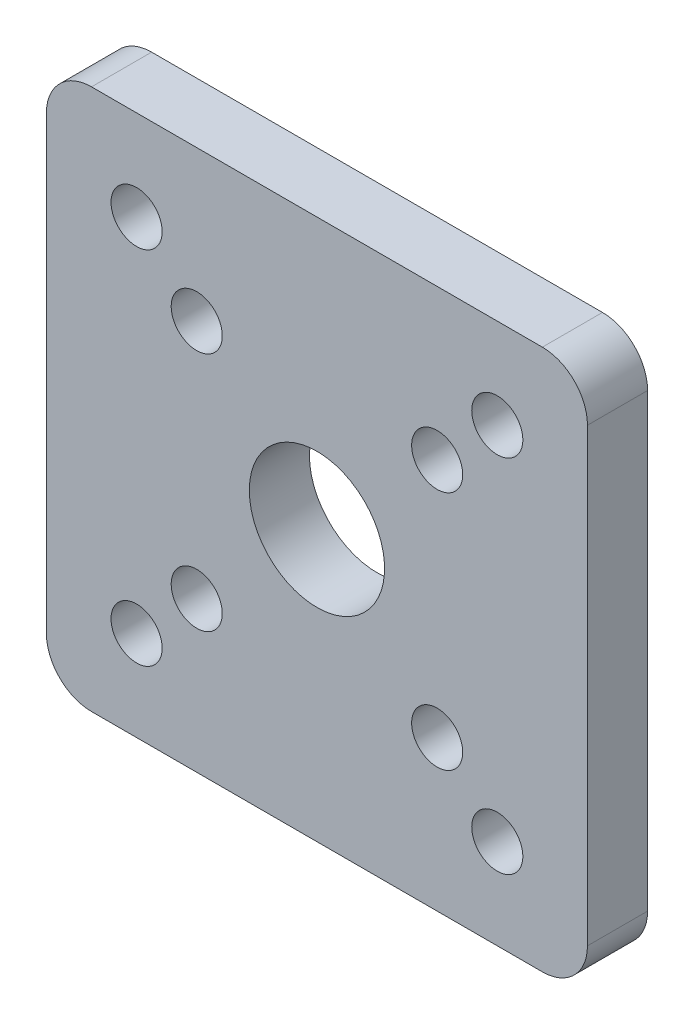
ISO-10303-21;
HEADER;
FILE_DESCRIPTION(('STEP AP214'),'2;1');
FILE_NAME('part.step','',(''),(''),'','','');
FILE_SCHEMA(('AUTOMOTIVE_DESIGN { 1 0 10303 214 1 1 1 1 }'));
ENDSEC;
DATA;
#1=APPLICATION_CONTEXT('core data for automotive mechanical design processes');
#2=APPLICATION_PROTOCOL_DEFINITION('international standard','automotive_design',2000,#1);
#3=PRODUCT_CONTEXT('',#1,'mechanical');
#4=PRODUCT('Part','Part','',(#3));
#5=PRODUCT_RELATED_PRODUCT_CATEGORY('part','',(#4));
#6=PRODUCT_DEFINITION_FORMATION('','',#4);
#7=PRODUCT_DEFINITION_CONTEXT('part definition',#1,'design');
#8=PRODUCT_DEFINITION('design','',#6,#7);
#9=PRODUCT_DEFINITION_SHAPE('','',#8);
#10=(LENGTH_UNIT() NAMED_UNIT(*) SI_UNIT(.MILLI.,.METRE.));
#11=(NAMED_UNIT(*) PLANE_ANGLE_UNIT() SI_UNIT($,.RADIAN.));
#12=(NAMED_UNIT(*) SI_UNIT($,.STERADIAN.) SOLID_ANGLE_UNIT());
#13=UNCERTAINTY_MEASURE_WITH_UNIT(LENGTH_MEASURE(1.E-05),#10,'distance_accuracy_value','');
#14=(GEOMETRIC_REPRESENTATION_CONTEXT(3) GLOBAL_UNCERTAINTY_ASSIGNED_CONTEXT((#13)) GLOBAL_UNIT_ASSIGNED_CONTEXT((#10,
#11,#12)) REPRESENTATION_CONTEXT('',''));
#15=CARTESIAN_POINT('',(0.,0.,0.));
#16=DIRECTION('',(0.,0.,1.));
#17=DIRECTION('',(1.,0.,0.));
#18=AXIS2_PLACEMENT_3D('',#15,#16,#17);
#19=CARTESIAN_POINT('',(127.,60.,12.));
#20=DIRECTION('',(0.,0.,1.));
#21=DIRECTION('',(1.,0.,0.));
#22=AXIS2_PLACEMENT_3D('',#19,#20,#21);
#23=PLANE('',#22);
#24=CARTESIAN_POINT('',(157.,90.,12.));
#25=DIRECTION('',(0.,0.,-1.));
#26=DIRECTION('',(-1.,0.,0.));
#27=AXIS2_PLACEMENT_3D('',#24,#25,#26);
#28=CIRCLE('',#27,1.7);
#29=CARTESIAN_POINT('',(155.3,90.,12.));
#30=VERTEX_POINT('',#29);
#31=EDGE_CURVE('E151',#30,#30,#28,.F.);
#32=ORIENTED_EDGE('',*,*,#31,.T.);
#33=EDGE_LOOP('',(#32));
#34=FACE_BOUND('',#33,.T.);
#35=CARTESIAN_POINT('',(153.,86.,12.));
#36=DIRECTION('',(0.,0.,-1.));
#37=DIRECTION('',(-1.,0.,0.));
#38=AXIS2_PLACEMENT_3D('',#35,#36,#37);
#39=CIRCLE('',#38,1.7);
#40=CARTESIAN_POINT('',(151.3,86.,12.));
#41=VERTEX_POINT('',#40);
#42=EDGE_CURVE('E154',#41,#41,#39,.F.);
#43=ORIENTED_EDGE('',*,*,#42,.T.);
#44=EDGE_LOOP('',(#43));
#45=FACE_BOUND('',#44,.T.);
#46=CARTESIAN_POINT('',(145.,78.,12.));
#47=DIRECTION('',(0.,0.,-1.));
#48=DIRECTION('',(-1.,0.,0.));
#49=AXIS2_PLACEMENT_3D('',#46,#47,#48);
#50=CIRCLE('',#49,4.5);
#51=CARTESIAN_POINT('',(140.5,78.,12.));
#52=VERTEX_POINT('',#51);
#53=EDGE_CURVE('E157',#52,#52,#50,.F.);
#54=ORIENTED_EDGE('',*,*,#53,.T.);
#55=EDGE_LOOP('',(#54));
#56=FACE_BOUND('',#55,.T.);
#57=CARTESIAN_POINT('',(133.,90.,12.));
#58=DIRECTION('',(0.,0.,-1.));
#59=DIRECTION('',(-1.,0.,0.));
#60=AXIS2_PLACEMENT_3D('',#57,#58,#59);
#61=CIRCLE('',#60,1.7);
#62=CARTESIAN_POINT('',(131.3,90.,12.));
#63=VERTEX_POINT('',#62);
#64=EDGE_CURVE('E160',#63,#63,#61,.F.);
#65=ORIENTED_EDGE('',*,*,#64,.T.);
#66=EDGE_LOOP('',(#65));
#67=FACE_BOUND('',#66,.T.);
#68=CARTESIAN_POINT('',(137.,86.,12.));
#69=DIRECTION('',(0.,0.,-1.));
#70=DIRECTION('',(-1.,0.,0.));
#71=AXIS2_PLACEMENT_3D('',#68,#69,#70);
#72=CIRCLE('',#71,1.7);
#73=CARTESIAN_POINT('',(135.3,86.,12.));
#74=VERTEX_POINT('',#73);
#75=EDGE_CURVE('E163',#74,#74,#72,.F.);
#76=ORIENTED_EDGE('',*,*,#75,.T.);
#77=EDGE_LOOP('',(#76));
#78=FACE_BOUND('',#77,.T.);
#79=CARTESIAN_POINT('',(153.,70.,12.));
#80=DIRECTION('',(0.,0.,-1.));
#81=DIRECTION('',(-1.,0.,0.));
#82=AXIS2_PLACEMENT_3D('',#79,#80,#81);
#83=CIRCLE('',#82,1.7);
#84=CARTESIAN_POINT('',(151.3,70.,12.));
#85=VERTEX_POINT('',#84);
#86=EDGE_CURVE('E166',#85,#85,#83,.F.);
#87=ORIENTED_EDGE('',*,*,#86,.T.);
#88=EDGE_LOOP('',(#87));
#89=FACE_BOUND('',#88,.T.);
#90=CARTESIAN_POINT('',(157.,66.,12.));
#91=DIRECTION('',(0.,0.,-1.));
#92=DIRECTION('',(-1.,0.,0.));
#93=AXIS2_PLACEMENT_3D('',#90,#91,#92);
#94=CIRCLE('',#93,1.7);
#95=CARTESIAN_POINT('',(155.3,66.,12.));
#96=VERTEX_POINT('',#95);
#97=EDGE_CURVE('E169',#96,#96,#94,.F.);
#98=ORIENTED_EDGE('',*,*,#97,.T.);
#99=EDGE_LOOP('',(#98));
#100=FACE_BOUND('',#99,.T.);
#101=CARTESIAN_POINT('',(137.,70.,12.));
#102=DIRECTION('',(0.,0.,-1.));
#103=DIRECTION('',(-1.,0.,0.));
#104=AXIS2_PLACEMENT_3D('',#101,#102,#103);
#105=CIRCLE('',#104,1.7);
#106=CARTESIAN_POINT('',(135.3,70.,12.));
#107=VERTEX_POINT('',#106);
#108=EDGE_CURVE('E172',#107,#107,#105,.F.);
#109=ORIENTED_EDGE('',*,*,#108,.T.);
#110=EDGE_LOOP('',(#109));
#111=FACE_BOUND('',#110,.T.);
#112=CARTESIAN_POINT('',(133.,66.,12.));
#113=DIRECTION('',(0.,0.,-1.));
#114=DIRECTION('',(-1.,0.,0.));
#115=AXIS2_PLACEMENT_3D('',#112,#113,#114);
#116=CIRCLE('',#115,1.7);
#117=CARTESIAN_POINT('',(131.3,66.,12.));
#118=VERTEX_POINT('',#117);
#119=EDGE_CURVE('E175',#118,#118,#116,.F.);
#120=ORIENTED_EDGE('',*,*,#119,.T.);
#121=EDGE_LOOP('',(#120));
#122=FACE_BOUND('',#121,.T.);
#123=DIRECTION('',(1.,0.,0.));
#124=VECTOR('',#123,1.);
#125=CARTESIAN_POINT('',(127.,96.,12.));
#126=LINE('',#125,#124);
#127=CARTESIAN_POINT('',(160.,96.,12.));
#128=VERTEX_POINT('',#127);
#129=CARTESIAN_POINT('',(130.,96.,12.));
#130=VERTEX_POINT('',#129);
#131=EDGE_CURVE('E104',#128,#130,#126,.F.);
#132=ORIENTED_EDGE('',*,*,#131,.F.);
#133=CARTESIAN_POINT('',(160.,93.,12.));
#134=DIRECTION('',(0.,0.,1.));
#135=DIRECTION('',(1.,0.,0.));
#136=AXIS2_PLACEMENT_3D('',#133,#134,#135);
#137=CIRCLE('',#136,3.);
#138=CARTESIAN_POINT('',(163.,93.,12.));
#139=VERTEX_POINT('',#138);
#140=EDGE_CURVE('E111',#139,#128,#137,.T.);
#141=ORIENTED_EDGE('',*,*,#140,.F.);
#142=DIRECTION('',(0.,1.,0.));
#143=VECTOR('',#142,1.);
#144=CARTESIAN_POINT('',(163.,60.,12.));
#145=LINE('',#144,#143);
#146=CARTESIAN_POINT('',(163.,63.,12.));
#147=VERTEX_POINT('',#146);
#148=EDGE_CURVE('E109',#147,#139,#145,.T.);
#149=ORIENTED_EDGE('',*,*,#148,.F.);
#150=CARTESIAN_POINT('',(160.,63.,12.));
#151=DIRECTION('',(0.,0.,1.));
#152=DIRECTION('',(1.,0.,0.));
#153=AXIS2_PLACEMENT_3D('',#150,#151,#152);
#154=CIRCLE('',#153,3.);
#155=CARTESIAN_POINT('',(160.,60.,12.));
#156=VERTEX_POINT('',#155);
#157=EDGE_CURVE('E81',#156,#147,#154,.T.);
#158=ORIENTED_EDGE('',*,*,#157,.F.);
#159=DIRECTION('',(1.,0.,0.));
#160=VECTOR('',#159,1.);
#161=CARTESIAN_POINT('',(127.,60.,12.));
#162=LINE('',#161,#160);
#163=CARTESIAN_POINT('',(130.,60.,12.));
#164=VERTEX_POINT('',#163);
#165=EDGE_CURVE('E79',#156,#164,#162,.F.);
#166=ORIENTED_EDGE('',*,*,#165,.T.);
#167=CARTESIAN_POINT('',(130.,63.,12.));
#168=DIRECTION('',(0.,0.,1.));
#169=DIRECTION('',(1.,0.,0.));
#170=AXIS2_PLACEMENT_3D('',#167,#168,#169);
#171=CIRCLE('',#170,3.);
#172=CARTESIAN_POINT('',(127.,63.,12.));
#173=VERTEX_POINT('',#172);
#174=EDGE_CURVE('E18',#173,#164,#171,.T.);
#175=ORIENTED_EDGE('',*,*,#174,.F.);
#176=DIRECTION('',(0.,1.,0.));
#177=VECTOR('',#176,1.);
#178=CARTESIAN_POINT('',(127.,60.,12.));
#179=LINE('',#178,#177);
#180=CARTESIAN_POINT('',(127.,93.,12.));
#181=VERTEX_POINT('',#180);
#182=EDGE_CURVE('E93',#173,#181,#179,.T.);
#183=ORIENTED_EDGE('',*,*,#182,.T.);
#184=CARTESIAN_POINT('',(130.,93.,12.));
#185=DIRECTION('',(0.,0.,1.));
#186=DIRECTION('',(1.,0.,0.));
#187=AXIS2_PLACEMENT_3D('',#184,#185,#186);
#188=CIRCLE('',#187,3.);
#189=EDGE_CURVE('E178',#130,#181,#188,.T.);
#190=ORIENTED_EDGE('',*,*,#189,.F.);
#191=EDGE_LOOP('',(#132,#141,#149,#158,#166,#175,#183,#190));
#192=FACE_BOUND('',#191,.T.);
#193=ADVANCED_FACE('F15',(#34,#45,#56,#67,#78,#89,#100,#111,#122,#192),#23,.F.);
#194=CARTESIAN_POINT('',(127.,60.,12.));
#195=DIRECTION('',(1.,0.,0.));
#196=DIRECTION('',(0.,0.,-1.));
#197=AXIS2_PLACEMENT_3D('',#194,#195,#196);
#198=PLANE('',#197);
#199=ORIENTED_EDGE('',*,*,#182,.F.);
#200=DIRECTION('',(0.,0.,1.));
#201=VECTOR('',#200,1.);
#202=CARTESIAN_POINT('',(127.,63.,12.));
#203=LINE('',#202,#201);
#204=CARTESIAN_POINT('',(127.,63.,16.));
#205=VERTEX_POINT('',#204);
#206=EDGE_CURVE('E86',#205,#173,#203,.F.);
#207=ORIENTED_EDGE('',*,*,#206,.F.);
#208=DIRECTION('',(0.,1.,0.));
#209=VECTOR('',#208,1.);
#210=CARTESIAN_POINT('',(127.,60.,16.));
#211=LINE('',#210,#209);
#212=CARTESIAN_POINT('',(127.,93.,16.));
#213=VERTEX_POINT('',#212);
#214=EDGE_CURVE('E150',#213,#205,#211,.F.);
#215=ORIENTED_EDGE('',*,*,#214,.F.);
#216=DIRECTION('',(0.,0.,1.));
#217=VECTOR('',#216,1.);
#218=CARTESIAN_POINT('',(127.,93.,12.));
#219=LINE('',#218,#217);
#220=EDGE_CURVE('E191',#181,#213,#219,.T.);
#221=ORIENTED_EDGE('',*,*,#220,.F.);
#222=EDGE_LOOP('',(#199,#207,#215,#221));
#223=FACE_BOUND('',#222,.T.);
#224=ADVANCED_FACE('F374',(#223),#198,.F.);
#225=CARTESIAN_POINT('',(130.,63.,12.));
#226=DIRECTION('',(0.,0.,1.));
#227=DIRECTION('',(1.,0.,0.));
#228=AXIS2_PLACEMENT_3D('',#225,#226,#227);
#229=CYLINDRICAL_SURFACE('',#228,3.);
#230=CARTESIAN_POINT('',(130.,63.,16.));
#231=DIRECTION('',(0.,0.,1.));
#232=DIRECTION('',(1.,0.,0.));
#233=AXIS2_PLACEMENT_3D('',#230,#231,#232);
#234=CIRCLE('',#233,3.);
#235=CARTESIAN_POINT('',(130.,60.,16.));
#236=VERTEX_POINT('',#235);
#237=EDGE_CURVE('E148',#205,#236,#234,.T.);
#238=ORIENTED_EDGE('',*,*,#237,.F.);
#239=ORIENTED_EDGE('',*,*,#206,.T.);
#240=ORIENTED_EDGE('',*,*,#174,.T.);
#241=DIRECTION('',(0.,0.,1.));
#242=VECTOR('',#241,1.);
#243=CARTESIAN_POINT('',(130.,60.,12.));
#244=LINE('',#243,#242);
#245=EDGE_CURVE('E85',#164,#236,#244,.T.);
#246=ORIENTED_EDGE('',*,*,#245,.T.);
#247=EDGE_LOOP('',(#238,#239,#240,#246));
#248=FACE_BOUND('',#247,.T.);
#249=ADVANCED_FACE('F91',(#248),#229,.T.);
#250=CARTESIAN_POINT('',(127.,60.,12.));
#251=DIRECTION('',(0.,1.,0.));
#252=DIRECTION('',(0.,0.,1.));
#253=AXIS2_PLACEMENT_3D('',#250,#251,#252);
#254=PLANE('',#253);
#255=DIRECTION('',(1.,0.,0.));
#256=VECTOR('',#255,1.);
#257=CARTESIAN_POINT('',(127.,60.,16.));
#258=LINE('',#257,#256);
#259=CARTESIAN_POINT('',(160.,60.,16.));
#260=VERTEX_POINT('',#259);
#261=EDGE_CURVE('E96',#236,#260,#258,.T.);
#262=ORIENTED_EDGE('',*,*,#261,.F.);
#263=ORIENTED_EDGE('',*,*,#245,.F.);
#264=ORIENTED_EDGE('',*,*,#165,.F.);
#265=DIRECTION('',(0.,0.,1.));
#266=VECTOR('',#265,1.);
#267=CARTESIAN_POINT('',(160.,60.,12.));
#268=LINE('',#267,#266);
#269=EDGE_CURVE('E98',#260,#156,#268,.F.);
#270=ORIENTED_EDGE('',*,*,#269,.F.);
#271=EDGE_LOOP('',(#262,#263,#264,#270));
#272=FACE_BOUND('',#271,.T.);
#273=ADVANCED_FACE('F94',(#272),#254,.F.);
#274=CARTESIAN_POINT('',(160.,63.,12.));
#275=DIRECTION('',(0.,0.,1.));
#276=DIRECTION('',(1.,0.,0.));
#277=AXIS2_PLACEMENT_3D('',#274,#275,#276);
#278=CYLINDRICAL_SURFACE('',#277,3.);
#279=ORIENTED_EDGE('',*,*,#269,.T.);
#280=ORIENTED_EDGE('',*,*,#157,.T.);
#281=DIRECTION('',(0.,0.,-1.));
#282=VECTOR('',#281,1.);
#283=CARTESIAN_POINT('',(163.,63.,12.));
#284=LINE('',#283,#282);
#285=CARTESIAN_POINT('',(163.,63.,16.));
#286=VERTEX_POINT('',#285);
#287=EDGE_CURVE('E112',#286,#147,#284,.T.);
#288=ORIENTED_EDGE('',*,*,#287,.F.);
#289=CARTESIAN_POINT('',(160.,63.,16.));
#290=DIRECTION('',(0.,0.,1.));
#291=DIRECTION('',(1.,0.,0.));
#292=AXIS2_PLACEMENT_3D('',#289,#290,#291);
#293=CIRCLE('',#292,3.);
#294=EDGE_CURVE('E145',#260,#286,#293,.T.);
#295=ORIENTED_EDGE('',*,*,#294,.F.);
#296=EDGE_LOOP('',(#279,#280,#288,#295));
#297=FACE_BOUND('',#296,.T.);
#298=ADVANCED_FACE('F210',(#297),#278,.T.);
#299=CARTESIAN_POINT('',(163.,60.,12.));
#300=DIRECTION('',(1.,0.,0.));
#301=DIRECTION('',(0.,0.,-1.));
#302=AXIS2_PLACEMENT_3D('',#299,#300,#301);
#303=PLANE('',#302);
#304=ORIENTED_EDGE('',*,*,#148,.T.);
#305=DIRECTION('',(0.,0.,1.));
#306=VECTOR('',#305,1.);
#307=CARTESIAN_POINT('',(163.,93.,12.));
#308=LINE('',#307,#306);
#309=CARTESIAN_POINT('',(163.,93.,16.));
#310=VERTEX_POINT('',#309);
#311=EDGE_CURVE('E107',#310,#139,#308,.F.);
#312=ORIENTED_EDGE('',*,*,#311,.F.);
#313=DIRECTION('',(0.,1.,0.));
#314=VECTOR('',#313,1.);
#315=CARTESIAN_POINT('',(163.,60.,16.));
#316=LINE('',#315,#314);
#317=EDGE_CURVE('E144',#286,#310,#316,.T.);
#318=ORIENTED_EDGE('',*,*,#317,.F.);
#319=ORIENTED_EDGE('',*,*,#287,.T.);
#320=EDGE_LOOP('',(#304,#312,#318,#319));
#321=FACE_BOUND('',#320,.T.);
#322=ADVANCED_FACE('F208',(#321),#303,.T.);
#323=CARTESIAN_POINT('',(160.,93.,12.));
#324=DIRECTION('',(0.,0.,1.));
#325=DIRECTION('',(1.,0.,0.));
#326=AXIS2_PLACEMENT_3D('',#323,#324,#325);
#327=CYLINDRICAL_SURFACE('',#326,3.);
#328=CARTESIAN_POINT('',(160.,93.,16.));
#329=DIRECTION('',(0.,0.,1.));
#330=DIRECTION('',(1.,0.,0.));
#331=AXIS2_PLACEMENT_3D('',#328,#329,#330);
#332=CIRCLE('',#331,3.);
#333=CARTESIAN_POINT('',(160.,96.,16.));
#334=VERTEX_POINT('',#333);
#335=EDGE_CURVE('E141',#310,#334,#332,.T.);
#336=ORIENTED_EDGE('',*,*,#335,.F.);
#337=ORIENTED_EDGE('',*,*,#311,.T.);
#338=ORIENTED_EDGE('',*,*,#140,.T.);
#339=DIRECTION('',(0.,0.,1.));
#340=VECTOR('',#339,1.);
#341=CARTESIAN_POINT('',(160.,96.,12.));
#342=LINE('',#341,#340);
#343=EDGE_CURVE('E106',#334,#128,#342,.F.);
#344=ORIENTED_EDGE('',*,*,#343,.F.);
#345=EDGE_LOOP('',(#336,#337,#338,#344));
#346=FACE_BOUND('',#345,.T.);
#347=ADVANCED_FACE('F207',(#346),#327,.T.);
#348=CARTESIAN_POINT('',(127.,96.,12.));
#349=DIRECTION('',(0.,1.,0.));
#350=DIRECTION('',(0.,0.,1.));
#351=AXIS2_PLACEMENT_3D('',#348,#349,#350);
#352=PLANE('',#351);
#353=DIRECTION('',(1.,0.,0.));
#354=VECTOR('',#353,1.);
#355=CARTESIAN_POINT('',(127.,96.,16.));
#356=LINE('',#355,#354);
#357=CARTESIAN_POINT('',(130.,96.,16.));
#358=VERTEX_POINT('',#357);
#359=EDGE_CURVE('E140',#334,#358,#356,.F.);
#360=ORIENTED_EDGE('',*,*,#359,.F.);
#361=ORIENTED_EDGE('',*,*,#343,.T.);
#362=ORIENTED_EDGE('',*,*,#131,.T.);
#363=DIRECTION('',(0.,0.,1.));
#364=VECTOR('',#363,1.);
#365=CARTESIAN_POINT('',(130.,96.,12.));
#366=LINE('',#365,#364);
#367=EDGE_CURVE('E33',#358,#130,#366,.F.);
#368=ORIENTED_EDGE('',*,*,#367,.F.);
#369=EDGE_LOOP('',(#360,#361,#362,#368));
#370=FACE_BOUND('',#369,.T.);
#371=ADVANCED_FACE('F204',(#370),#352,.T.);
#372=CARTESIAN_POINT('',(130.,93.,12.));
#373=DIRECTION('',(0.,0.,1.));
#374=DIRECTION('',(1.,0.,0.));
#375=AXIS2_PLACEMENT_3D('',#372,#373,#374);
#376=CYLINDRICAL_SURFACE('',#375,3.);
#377=ORIENTED_EDGE('',*,*,#367,.T.);
#378=ORIENTED_EDGE('',*,*,#189,.T.);
#379=ORIENTED_EDGE('',*,*,#220,.T.);
#380=CARTESIAN_POINT('',(130.,93.,16.));
#381=DIRECTION('',(0.,0.,1.));
#382=DIRECTION('',(1.,0.,0.));
#383=AXIS2_PLACEMENT_3D('',#380,#381,#382);
#384=CIRCLE('',#383,3.);
#385=EDGE_CURVE('E137',#358,#213,#384,.T.);
#386=ORIENTED_EDGE('',*,*,#385,.F.);
#387=EDGE_LOOP('',(#377,#378,#379,#386));
#388=FACE_BOUND('',#387,.T.);
#389=ADVANCED_FACE('F262',(#388),#376,.T.);
#390=CARTESIAN_POINT('',(133.,66.,11.));
#391=DIRECTION('',(0.,0.,-1.));
#392=DIRECTION('',(-1.,0.,0.));
#393=AXIS2_PLACEMENT_3D('',#390,#391,#392);
#394=CYLINDRICAL_SURFACE('',#393,1.7);
#395=CARTESIAN_POINT('',(133.,66.,16.));
#396=DIRECTION('',(0.,0.,-1.));
#397=DIRECTION('',(-1.,0.,0.));
#398=AXIS2_PLACEMENT_3D('',#395,#396,#397);
#399=CIRCLE('',#398,1.7);
#400=CARTESIAN_POINT('',(131.3,66.,16.));
#401=VERTEX_POINT('',#400);
#402=EDGE_CURVE('E134',#401,#401,#399,.T.);
#403=ORIENTED_EDGE('',*,*,#402,.F.);
#404=EDGE_LOOP('',(#403));
#405=FACE_BOUND('',#404,.T.);
#406=ORIENTED_EDGE('',*,*,#119,.F.);
#407=EDGE_LOOP('',(#406));
#408=FACE_BOUND('',#407,.T.);
#409=ADVANCED_FACE('F258',(#405,#408),#394,.F.);
#410=CARTESIAN_POINT('',(137.,70.,11.));
#411=DIRECTION('',(0.,0.,-1.));
#412=DIRECTION('',(-1.,0.,0.));
#413=AXIS2_PLACEMENT_3D('',#410,#411,#412);
#414=CYLINDRICAL_SURFACE('',#413,1.7);
#415=CARTESIAN_POINT('',(137.,70.,16.));
#416=DIRECTION('',(0.,0.,-1.));
#417=DIRECTION('',(-1.,0.,0.));
#418=AXIS2_PLACEMENT_3D('',#415,#416,#417);
#419=CIRCLE('',#418,1.7);
#420=CARTESIAN_POINT('',(135.3,70.,16.));
#421=VERTEX_POINT('',#420);
#422=EDGE_CURVE('E131',#421,#421,#419,.T.);
#423=ORIENTED_EDGE('',*,*,#422,.F.);
#424=EDGE_LOOP('',(#423));
#425=FACE_BOUND('',#424,.T.);
#426=ORIENTED_EDGE('',*,*,#108,.F.);
#427=EDGE_LOOP('',(#426));
#428=FACE_BOUND('',#427,.T.);
#429=ADVANCED_FACE('F254',(#425,#428),#414,.F.);
#430=CARTESIAN_POINT('',(157.,66.,11.));
#431=DIRECTION('',(0.,0.,-1.));
#432=DIRECTION('',(-1.,0.,0.));
#433=AXIS2_PLACEMENT_3D('',#430,#431,#432);
#434=CYLINDRICAL_SURFACE('',#433,1.7);
#435=CARTESIAN_POINT('',(157.,66.,16.));
#436=DIRECTION('',(0.,0.,-1.));
#437=DIRECTION('',(-1.,0.,0.));
#438=AXIS2_PLACEMENT_3D('',#435,#436,#437);
#439=CIRCLE('',#438,1.7);
#440=CARTESIAN_POINT('',(155.3,66.,16.));
#441=VERTEX_POINT('',#440);
#442=EDGE_CURVE('E128',#441,#441,#439,.T.);
#443=ORIENTED_EDGE('',*,*,#442,.F.);
#444=EDGE_LOOP('',(#443));
#445=FACE_BOUND('',#444,.T.);
#446=ORIENTED_EDGE('',*,*,#97,.F.);
#447=EDGE_LOOP('',(#446));
#448=FACE_BOUND('',#447,.T.);
#449=ADVANCED_FACE('F250',(#445,#448),#434,.F.);
#450=CARTESIAN_POINT('',(153.,70.,11.));
#451=DIRECTION('',(0.,0.,-1.));
#452=DIRECTION('',(-1.,0.,0.));
#453=AXIS2_PLACEMENT_3D('',#450,#451,#452);
#454=CYLINDRICAL_SURFACE('',#453,1.7);
#455=CARTESIAN_POINT('',(153.,70.,16.));
#456=DIRECTION('',(0.,0.,-1.));
#457=DIRECTION('',(-1.,0.,0.));
#458=AXIS2_PLACEMENT_3D('',#455,#456,#457);
#459=CIRCLE('',#458,1.7);
#460=CARTESIAN_POINT('',(151.3,70.,16.));
#461=VERTEX_POINT('',#460);
#462=EDGE_CURVE('E125',#461,#461,#459,.T.);
#463=ORIENTED_EDGE('',*,*,#462,.F.);
#464=EDGE_LOOP('',(#463));
#465=FACE_BOUND('',#464,.T.);
#466=ORIENTED_EDGE('',*,*,#86,.F.);
#467=EDGE_LOOP('',(#466));
#468=FACE_BOUND('',#467,.T.);
#469=ADVANCED_FACE('F246',(#465,#468),#454,.F.);
#470=CARTESIAN_POINT('',(137.,86.,11.));
#471=DIRECTION('',(0.,0.,-1.));
#472=DIRECTION('',(-1.,0.,0.));
#473=AXIS2_PLACEMENT_3D('',#470,#471,#472);
#474=CYLINDRICAL_SURFACE('',#473,1.7);
#475=CARTESIAN_POINT('',(137.,86.,16.));
#476=DIRECTION('',(0.,0.,-1.));
#477=DIRECTION('',(-1.,0.,0.));
#478=AXIS2_PLACEMENT_3D('',#475,#476,#477);
#479=CIRCLE('',#478,1.7);
#480=CARTESIAN_POINT('',(135.3,86.,16.));
#481=VERTEX_POINT('',#480);
#482=EDGE_CURVE('E122',#481,#481,#479,.T.);
#483=ORIENTED_EDGE('',*,*,#482,.F.);
#484=EDGE_LOOP('',(#483));
#485=FACE_BOUND('',#484,.T.);
#486=ORIENTED_EDGE('',*,*,#75,.F.);
#487=EDGE_LOOP('',(#486));
#488=FACE_BOUND('',#487,.T.);
#489=ADVANCED_FACE('F242',(#485,#488),#474,.F.);
#490=CARTESIAN_POINT('',(133.,90.,11.));
#491=DIRECTION('',(0.,0.,-1.));
#492=DIRECTION('',(-1.,0.,0.));
#493=AXIS2_PLACEMENT_3D('',#490,#491,#492);
#494=CYLINDRICAL_SURFACE('',#493,1.7);
#495=CARTESIAN_POINT('',(133.,90.,16.));
#496=DIRECTION('',(0.,0.,-1.));
#497=DIRECTION('',(-1.,0.,0.));
#498=AXIS2_PLACEMENT_3D('',#495,#496,#497);
#499=CIRCLE('',#498,1.7);
#500=CARTESIAN_POINT('',(131.3,90.,16.));
#501=VERTEX_POINT('',#500);
#502=EDGE_CURVE('E119',#501,#501,#499,.T.);
#503=ORIENTED_EDGE('',*,*,#502,.F.);
#504=EDGE_LOOP('',(#503));
#505=FACE_BOUND('',#504,.T.);
#506=ORIENTED_EDGE('',*,*,#64,.F.);
#507=EDGE_LOOP('',(#506));
#508=FACE_BOUND('',#507,.T.);
#509=ADVANCED_FACE('F238',(#505,#508),#494,.F.);
#510=CARTESIAN_POINT('',(145.,78.,11.));
#511=DIRECTION('',(0.,0.,-1.));
#512=DIRECTION('',(-1.,0.,0.));
#513=AXIS2_PLACEMENT_3D('',#510,#511,#512);
#514=CYLINDRICAL_SURFACE('',#513,4.5);
#515=CARTESIAN_POINT('',(145.,78.,16.));
#516=DIRECTION('',(0.,0.,-1.));
#517=DIRECTION('',(-1.,0.,0.));
#518=AXIS2_PLACEMENT_3D('',#515,#516,#517);
#519=CIRCLE('',#518,4.5);
#520=CARTESIAN_POINT('',(140.5,78.,16.));
#521=VERTEX_POINT('',#520);
#522=EDGE_CURVE('E116',#521,#521,#519,.T.);
#523=ORIENTED_EDGE('',*,*,#522,.F.);
#524=EDGE_LOOP('',(#523));
#525=FACE_BOUND('',#524,.T.);
#526=ORIENTED_EDGE('',*,*,#53,.F.);
#527=EDGE_LOOP('',(#526));
#528=FACE_BOUND('',#527,.T.);
#529=ADVANCED_FACE('F234',(#525,#528),#514,.F.);
#530=CARTESIAN_POINT('',(153.,86.,11.));
#531=DIRECTION('',(0.,0.,-1.));
#532=DIRECTION('',(-1.,0.,0.));
#533=AXIS2_PLACEMENT_3D('',#530,#531,#532);
#534=CYLINDRICAL_SURFACE('',#533,1.7);
#535=CARTESIAN_POINT('',(153.,86.,16.));
#536=DIRECTION('',(0.,0.,-1.));
#537=DIRECTION('',(-1.,0.,0.));
#538=AXIS2_PLACEMENT_3D('',#535,#536,#537);
#539=CIRCLE('',#538,1.7);
#540=CARTESIAN_POINT('',(151.3,86.,16.));
#541=VERTEX_POINT('',#540);
#542=EDGE_CURVE('E24',#541,#541,#539,.T.);
#543=ORIENTED_EDGE('',*,*,#542,.F.);
#544=EDGE_LOOP('',(#543));
#545=FACE_BOUND('',#544,.T.);
#546=ORIENTED_EDGE('',*,*,#42,.F.);
#547=EDGE_LOOP('',(#546));
#548=FACE_BOUND('',#547,.T.);
#549=ADVANCED_FACE('F227',(#545,#548),#534,.F.);
#550=CARTESIAN_POINT('',(157.,90.,11.));
#551=DIRECTION('',(0.,0.,-1.));
#552=DIRECTION('',(-1.,0.,0.));
#553=AXIS2_PLACEMENT_3D('',#550,#551,#552);
#554=CYLINDRICAL_SURFACE('',#553,1.7);
#555=CARTESIAN_POINT('',(157.,90.,16.));
#556=DIRECTION('',(0.,0.,-1.));
#557=DIRECTION('',(-1.,0.,0.));
#558=AXIS2_PLACEMENT_3D('',#555,#556,#557);
#559=CIRCLE('',#558,1.7);
#560=CARTESIAN_POINT('',(155.3,90.,16.));
#561=VERTEX_POINT('',#560);
#562=EDGE_CURVE('E9',#561,#561,#559,.T.);
#563=ORIENTED_EDGE('',*,*,#562,.F.);
#564=EDGE_LOOP('',(#563));
#565=FACE_BOUND('',#564,.T.);
#566=ORIENTED_EDGE('',*,*,#31,.F.);
#567=EDGE_LOOP('',(#566));
#568=FACE_BOUND('',#567,.T.);
#569=ADVANCED_FACE('F221',(#565,#568),#554,.F.);
#570=CARTESIAN_POINT('',(127.,60.,16.));
#571=DIRECTION('',(0.,0.,1.));
#572=DIRECTION('',(1.,0.,0.));
#573=AXIS2_PLACEMENT_3D('',#570,#571,#572);
#574=PLANE('',#573);
#575=ORIENTED_EDGE('',*,*,#562,.T.);
#576=EDGE_LOOP('',(#575));
#577=FACE_BOUND('',#576,.T.);
#578=ORIENTED_EDGE('',*,*,#542,.T.);
#579=EDGE_LOOP('',(#578));
#580=FACE_BOUND('',#579,.T.);
#581=ORIENTED_EDGE('',*,*,#522,.T.);
#582=EDGE_LOOP('',(#581));
#583=FACE_BOUND('',#582,.T.);
#584=ORIENTED_EDGE('',*,*,#502,.T.);
#585=EDGE_LOOP('',(#584));
#586=FACE_BOUND('',#585,.T.);
#587=ORIENTED_EDGE('',*,*,#482,.T.);
#588=EDGE_LOOP('',(#587));
#589=FACE_BOUND('',#588,.T.);
#590=ORIENTED_EDGE('',*,*,#462,.T.);
#591=EDGE_LOOP('',(#590));
#592=FACE_BOUND('',#591,.T.);
#593=ORIENTED_EDGE('',*,*,#442,.T.);
#594=EDGE_LOOP('',(#593));
#595=FACE_BOUND('',#594,.T.);
#596=ORIENTED_EDGE('',*,*,#422,.T.);
#597=EDGE_LOOP('',(#596));
#598=FACE_BOUND('',#597,.T.);
#599=ORIENTED_EDGE('',*,*,#402,.T.);
#600=EDGE_LOOP('',(#599));
#601=FACE_BOUND('',#600,.T.);
#602=ORIENTED_EDGE('',*,*,#359,.T.);
#603=ORIENTED_EDGE('',*,*,#385,.T.);
#604=ORIENTED_EDGE('',*,*,#214,.T.);
#605=ORIENTED_EDGE('',*,*,#237,.T.);
#606=ORIENTED_EDGE('',*,*,#261,.T.);
#607=ORIENTED_EDGE('',*,*,#294,.T.);
#608=ORIENTED_EDGE('',*,*,#317,.T.);
#609=ORIENTED_EDGE('',*,*,#335,.T.);
#610=EDGE_LOOP('',(#602,#603,#604,#605,#606,#607,#608,#609));
#611=FACE_BOUND('',#610,.T.);
#612=ADVANCED_FACE('F202',(#577,#580,#583,#586,#589,#592,#595,#598,#601,#611),#574,.T.);
#613=CLOSED_SHELL('',(#193,#224,#249,#273,#298,#322,#347,#371,#389,#409,#429,#449,#469,#489,
#509,#529,#549,#569,#612));
#614=MANIFOLD_SOLID_BREP('B1',#613);
#615=ADVANCED_BREP_SHAPE_REPRESENTATION('',(#18,#614),#14);
#616=SHAPE_DEFINITION_REPRESENTATION(#9,#615);
ENDSEC;
END-ISO-10303-21;
